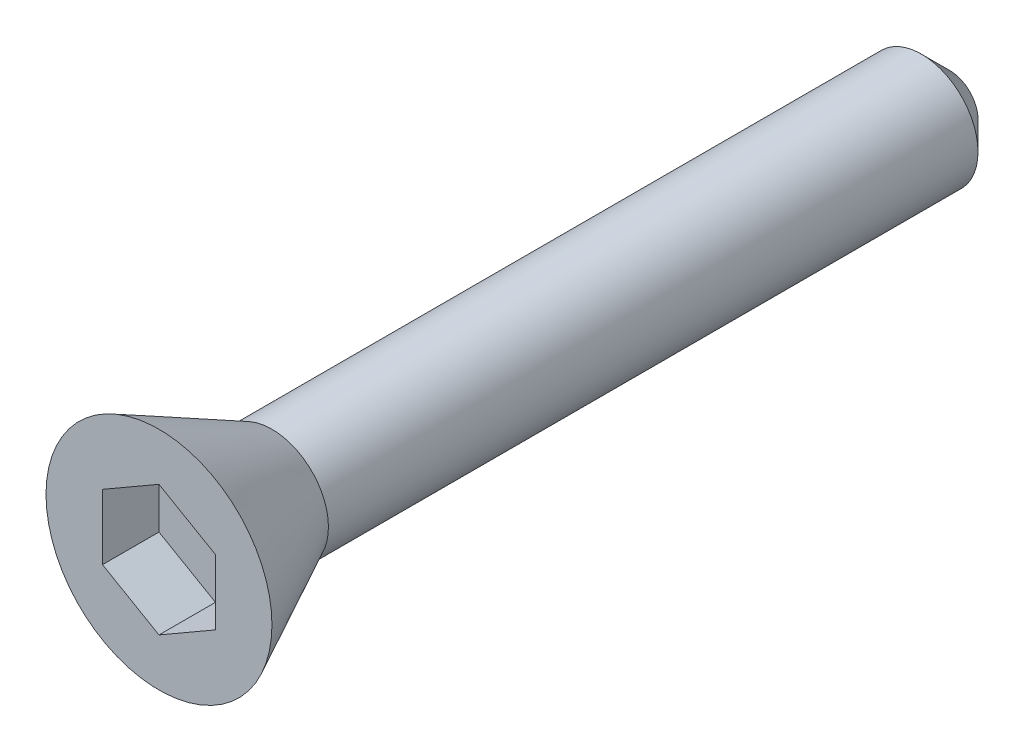
ISO-10303-21;
HEADER;
FILE_DESCRIPTION(('STEP AP214'),'2;1');
FILE_NAME('part.step','',(''),(''),'','','');
FILE_SCHEMA(('AUTOMOTIVE_DESIGN { 1 0 10303 214 1 1 1 1 }'));
ENDSEC;
DATA;
#1=APPLICATION_CONTEXT('core data for automotive mechanical design processes');
#2=APPLICATION_PROTOCOL_DEFINITION('international standard','automotive_design',2000,#1);
#3=PRODUCT_CONTEXT('',#1,'mechanical');
#4=PRODUCT('Part','Part','',(#3));
#5=PRODUCT_RELATED_PRODUCT_CATEGORY('part','',(#4));
#6=PRODUCT_DEFINITION_FORMATION('','',#4);
#7=PRODUCT_DEFINITION_CONTEXT('part definition',#1,'design');
#8=PRODUCT_DEFINITION('design','',#6,#7);
#9=PRODUCT_DEFINITION_SHAPE('','',#8);
#10=(LENGTH_UNIT() NAMED_UNIT(*) SI_UNIT(.MILLI.,.METRE.));
#11=(NAMED_UNIT(*) PLANE_ANGLE_UNIT() SI_UNIT($,.RADIAN.));
#12=(NAMED_UNIT(*) SI_UNIT($,.STERADIAN.) SOLID_ANGLE_UNIT());
#13=UNCERTAINTY_MEASURE_WITH_UNIT(LENGTH_MEASURE(1.E-05),#10,'distance_accuracy_value','');
#14=(GEOMETRIC_REPRESENTATION_CONTEXT(3) GLOBAL_UNCERTAINTY_ASSIGNED_CONTEXT((#13)) GLOBAL_UNIT_ASSIGNED_CONTEXT((#10,
#11,#12)) REPRESENTATION_CONTEXT('',''));
#15=CARTESIAN_POINT('',(0.,0.,0.));
#16=DIRECTION('',(0.,0.,1.));
#17=DIRECTION('',(1.,0.,0.));
#18=AXIS2_PLACEMENT_3D('',#15,#16,#17);
#19=CARTESIAN_POINT('',(0.,0.,0.));
#20=DIRECTION('',(0.,0.,-1.));
#21=DIRECTION('',(-1.,0.,0.));
#22=AXIS2_PLACEMENT_3D('',#19,#20,#21);
#23=PLANE('',#22);
#24=DIRECTION('',(-0.866025403784439,-0.5,0.));
#25=VECTOR('',#24,1.);
#26=CARTESIAN_POINT('',(0.,1.15470053837925,0.));
#27=LINE('',#26,#25);
#28=CARTESIAN_POINT('',(0.,1.15470053837925,0.));
#29=VERTEX_POINT('',#28);
#30=CARTESIAN_POINT('',(-1.,0.577350269189626,0.));
#31=VERTEX_POINT('',#30);
#32=EDGE_CURVE('E121',#29,#31,#27,.T.);
#33=ORIENTED_EDGE('',*,*,#32,.F.);
#34=DIRECTION('',(-0.866025403784439,0.5,0.));
#35=VECTOR('',#34,1.);
#36=CARTESIAN_POINT('',(1.,0.577350269189626,0.));
#37=LINE('',#36,#35);
#38=CARTESIAN_POINT('',(1.,0.577350269189626,0.));
#39=VERTEX_POINT('',#38);
#40=EDGE_CURVE('E47',#39,#29,#37,.T.);
#41=ORIENTED_EDGE('',*,*,#40,.F.);
#42=DIRECTION('',(0.,1.,0.));
#43=VECTOR('',#42,1.);
#44=CARTESIAN_POINT('',(1.,-0.577350269189626,0.));
#45=LINE('',#44,#43);
#46=CARTESIAN_POINT('',(1.,-0.577350269189626,0.));
#47=VERTEX_POINT('',#46);
#48=EDGE_CURVE('E130',#47,#39,#45,.T.);
#49=ORIENTED_EDGE('',*,*,#48,.F.);
#50=DIRECTION('',(0.866025403784439,0.5,0.));
#51=VECTOR('',#50,1.);
#52=CARTESIAN_POINT('',(0.,-1.15470053837925,0.));
#53=LINE('',#52,#51);
#54=CARTESIAN_POINT('',(0.,-1.15470053837925,0.));
#55=VERTEX_POINT('',#54);
#56=EDGE_CURVE('E128',#55,#47,#53,.T.);
#57=ORIENTED_EDGE('',*,*,#56,.F.);
#58=DIRECTION('',(0.866025403784439,-0.5,0.));
#59=VECTOR('',#58,1.);
#60=CARTESIAN_POINT('',(-1.,-0.577350269189626,0.));
#61=LINE('',#60,#59);
#62=CARTESIAN_POINT('',(-1.,-0.577350269189626,0.));
#63=VERTEX_POINT('',#62);
#64=EDGE_CURVE('E95',#63,#55,#61,.T.);
#65=ORIENTED_EDGE('',*,*,#64,.F.);
#66=DIRECTION('',(0.,-1.,0.));
#67=VECTOR('',#66,1.);
#68=CARTESIAN_POINT('',(-1.,0.577350269189626,0.));
#69=LINE('',#68,#67);
#70=EDGE_CURVE('E124',#31,#63,#69,.T.);
#71=ORIENTED_EDGE('',*,*,#70,.F.);
#72=EDGE_LOOP('',(#33,#41,#49,#57,#65,#71));
#73=FACE_BOUND('',#72,.T.);
#74=CARTESIAN_POINT('',(0.,0.,0.));
#75=DIRECTION('',(0.,0.,1.));
#76=DIRECTION('',(1.,0.,0.));
#77=AXIS2_PLACEMENT_3D('',#74,#75,#76);
#78=CIRCLE('',#77,2.);
#79=CARTESIAN_POINT('',(2.,0.,0.));
#80=VERTEX_POINT('',#79);
#81=EDGE_CURVE('E142',#80,#80,#78,.T.);
#82=ORIENTED_EDGE('',*,*,#81,.T.);
#83=EDGE_LOOP('',(#82));
#84=FACE_BOUND('',#83,.T.);
#85=ADVANCED_FACE('F32',(#73,#84),#23,.F.);
#86=CARTESIAN_POINT('',(0.,0.,-2.));
#87=DIRECTION('',(0.,0.,1.));
#88=DIRECTION('',(1.,0.,0.));
#89=AXIS2_PLACEMENT_3D('',#86,#87,#88);
#90=CONICAL_SURFACE('',#89,1.,0.463647609000806);
#91=ORIENTED_EDGE('',*,*,#81,.F.);
#92=EDGE_LOOP('',(#91));
#93=FACE_BOUND('',#92,.T.);
#94=CARTESIAN_POINT('',(0.,0.,-2.));
#95=DIRECTION('',(0.,0.,1.));
#96=DIRECTION('',(1.,0.,0.));
#97=AXIS2_PLACEMENT_3D('',#94,#95,#96);
#98=CIRCLE('',#97,1.);
#99=CARTESIAN_POINT('',(1.,0.,-2.));
#100=VERTEX_POINT('',#99);
#101=EDGE_CURVE('E134',#100,#100,#98,.T.);
#102=ORIENTED_EDGE('',*,*,#101,.T.);
#103=EDGE_LOOP('',(#102));
#104=FACE_BOUND('',#103,.T.);
#105=ADVANCED_FACE('F159',(#93,#104),#90,.T.);
#106=CARTESIAN_POINT('',(0.,0.,58.5147444804715));
#107=DIRECTION('',(0.,0.,1.));
#108=DIRECTION('',(1.,0.,0.));
#109=AXIS2_PLACEMENT_3D('',#106,#107,#108);
#110=CYLINDRICAL_SURFACE('',#109,1.);
#111=CARTESIAN_POINT('',(0.,0.,-13.5));
#112=DIRECTION('',(0.,0.,1.));
#113=DIRECTION('',(1.,0.,0.));
#114=AXIS2_PLACEMENT_3D('',#111,#112,#113);
#115=CIRCLE('',#114,1.);
#116=CARTESIAN_POINT('',(1.,0.,-13.5));
#117=VERTEX_POINT('',#116);
#118=EDGE_CURVE('E40',#117,#117,#115,.T.);
#119=ORIENTED_EDGE('',*,*,#118,.T.);
#120=EDGE_LOOP('',(#119));
#121=FACE_BOUND('',#120,.T.);
#122=ORIENTED_EDGE('',*,*,#101,.F.);
#123=EDGE_LOOP('',(#122));
#124=FACE_BOUND('',#123,.T.);
#125=ADVANCED_FACE('F147',(#121,#124),#110,.T.);
#126=CARTESIAN_POINT('',(0.,1.,-14.));
#127=DIRECTION('',(0.,0.,1.));
#128=DIRECTION('',(1.,0.,0.));
#129=AXIS2_PLACEMENT_3D('',#126,#127,#128);
#130=PLANE('',#129);
#131=CARTESIAN_POINT('',(0.,0.,-14.));
#132=DIRECTION('',(0.,0.,1.));
#133=DIRECTION('',(1.,0.,0.));
#134=AXIS2_PLACEMENT_3D('',#131,#132,#133);
#135=CIRCLE('',#134,0.500000000000009);
#136=CARTESIAN_POINT('',(0.500000000000009,0.,-14.));
#137=VERTEX_POINT('',#136);
#138=EDGE_CURVE('E11',#137,#137,#135,.F.);
#139=ORIENTED_EDGE('',*,*,#138,.T.);
#140=EDGE_LOOP('',(#139));
#141=FACE_BOUND('',#140,.T.);
#142=ADVANCED_FACE('F171',(#141),#130,.F.);
#143=CARTESIAN_POINT('',(1.,0.577350269189626,-1.));
#144=DIRECTION('',(0.5,0.866025403784439,0.));
#145=DIRECTION('',(-0.866025403784439,0.5,0.));
#146=AXIS2_PLACEMENT_3D('',#143,#144,#145);
#147=PLANE('',#146);
#148=ORIENTED_EDGE('',*,*,#40,.T.);
#149=DIRECTION('',(0.,0.,1.));
#150=VECTOR('',#149,1.);
#151=CARTESIAN_POINT('',(0.,1.15470053837925,-1.));
#152=LINE('',#151,#150);
#153=CARTESIAN_POINT('',(0.,1.15470053837925,-1.));
#154=VERTEX_POINT('',#153);
#155=EDGE_CURVE('E77',#154,#29,#152,.T.);
#156=ORIENTED_EDGE('',*,*,#155,.F.);
#157=DIRECTION('',(-0.866025403784439,0.5,0.));
#158=VECTOR('',#157,1.);
#159=CARTESIAN_POINT('',(1.,0.577350269189626,-1.));
#160=LINE('',#159,#158);
#161=CARTESIAN_POINT('',(1.,0.577350269189626,-1.));
#162=VERTEX_POINT('',#161);
#163=EDGE_CURVE('E132',#162,#154,#160,.T.);
#164=ORIENTED_EDGE('',*,*,#163,.F.);
#165=DIRECTION('',(0.,0.,1.));
#166=VECTOR('',#165,1.);
#167=CARTESIAN_POINT('',(1.,0.577350269189626,-1.));
#168=LINE('',#167,#166);
#169=EDGE_CURVE('E55',#162,#39,#168,.T.);
#170=ORIENTED_EDGE('',*,*,#169,.T.);
#171=EDGE_LOOP('',(#148,#156,#164,#170));
#172=FACE_BOUND('',#171,.T.);
#173=ADVANCED_FACE('F174',(#172),#147,.F.);
#174=CARTESIAN_POINT('',(1.,-0.577350269189626,-1.));
#175=DIRECTION('',(1.,0.,0.));
#176=DIRECTION('',(0.,0.,-1.));
#177=AXIS2_PLACEMENT_3D('',#174,#175,#176);
#178=PLANE('',#177);
#179=ORIENTED_EDGE('',*,*,#48,.T.);
#180=ORIENTED_EDGE('',*,*,#169,.F.);
#181=DIRECTION('',(0.,1.,0.));
#182=VECTOR('',#181,1.);
#183=CARTESIAN_POINT('',(1.,-0.577350269189626,-1.));
#184=LINE('',#183,#182);
#185=CARTESIAN_POINT('',(1.,-0.577350269189626,-1.));
#186=VERTEX_POINT('',#185);
#187=EDGE_CURVE('E107',#186,#162,#184,.T.);
#188=ORIENTED_EDGE('',*,*,#187,.F.);
#189=DIRECTION('',(0.,0.,1.));
#190=VECTOR('',#189,1.);
#191=CARTESIAN_POINT('',(1.,-0.577350269189626,-1.));
#192=LINE('',#191,#190);
#193=EDGE_CURVE('E99',#186,#47,#192,.T.);
#194=ORIENTED_EDGE('',*,*,#193,.T.);
#195=EDGE_LOOP('',(#179,#180,#188,#194));
#196=FACE_BOUND('',#195,.T.);
#197=ADVANCED_FACE('F178',(#196),#178,.F.);
#198=CARTESIAN_POINT('',(0.,-1.15470053837925,-1.));
#199=DIRECTION('',(0.5,-0.866025403784439,0.));
#200=DIRECTION('',(0.866025403784439,0.5,0.));
#201=AXIS2_PLACEMENT_3D('',#198,#199,#200);
#202=PLANE('',#201);
#203=ORIENTED_EDGE('',*,*,#56,.T.);
#204=ORIENTED_EDGE('',*,*,#193,.F.);
#205=DIRECTION('',(0.866025403784439,0.5,0.));
#206=VECTOR('',#205,1.);
#207=CARTESIAN_POINT('',(0.,-1.15470053837925,-1.));
#208=LINE('',#207,#206);
#209=CARTESIAN_POINT('',(0.,-1.15470053837925,-1.));
#210=VERTEX_POINT('',#209);
#211=EDGE_CURVE('E103',#210,#186,#208,.T.);
#212=ORIENTED_EDGE('',*,*,#211,.F.);
#213=DIRECTION('',(0.,0.,1.));
#214=VECTOR('',#213,1.);
#215=CARTESIAN_POINT('',(0.,-1.15470053837925,-1.));
#216=LINE('',#215,#214);
#217=EDGE_CURVE('E88',#210,#55,#216,.T.);
#218=ORIENTED_EDGE('',*,*,#217,.T.);
#219=EDGE_LOOP('',(#203,#204,#212,#218));
#220=FACE_BOUND('',#219,.T.);
#221=ADVANCED_FACE('F104',(#220),#202,.F.);
#222=CARTESIAN_POINT('',(-1.,-0.577350269189626,-1.));
#223=DIRECTION('',(-0.5,-0.866025403784439,0.));
#224=DIRECTION('',(0.866025403784439,-0.5,0.));
#225=AXIS2_PLACEMENT_3D('',#222,#223,#224);
#226=PLANE('',#225);
#227=ORIENTED_EDGE('',*,*,#64,.T.);
#228=ORIENTED_EDGE('',*,*,#217,.F.);
#229=DIRECTION('',(0.866025403784439,-0.5,0.));
#230=VECTOR('',#229,1.);
#231=CARTESIAN_POINT('',(-1.,-0.577350269189626,-1.));
#232=LINE('',#231,#230);
#233=CARTESIAN_POINT('',(-1.,-0.577350269189626,-1.));
#234=VERTEX_POINT('',#233);
#235=EDGE_CURVE('E92',#234,#210,#232,.T.);
#236=ORIENTED_EDGE('',*,*,#235,.F.);
#237=DIRECTION('',(0.,0.,1.));
#238=VECTOR('',#237,1.);
#239=CARTESIAN_POINT('',(-1.,-0.577350269189626,-1.));
#240=LINE('',#239,#238);
#241=EDGE_CURVE('E100',#234,#63,#240,.T.);
#242=ORIENTED_EDGE('',*,*,#241,.T.);
#243=EDGE_LOOP('',(#227,#228,#236,#242));
#244=FACE_BOUND('',#243,.T.);
#245=ADVANCED_FACE('F90',(#244),#226,.F.);
#246=CARTESIAN_POINT('',(-1.,0.577350269189626,-1.));
#247=DIRECTION('',(-1.,0.,0.));
#248=DIRECTION('',(0.,0.,1.));
#249=AXIS2_PLACEMENT_3D('',#246,#247,#248);
#250=PLANE('',#249);
#251=ORIENTED_EDGE('',*,*,#70,.T.);
#252=ORIENTED_EDGE('',*,*,#241,.F.);
#253=DIRECTION('',(0.,-1.,0.));
#254=VECTOR('',#253,1.);
#255=CARTESIAN_POINT('',(-1.,0.577350269189626,-1.));
#256=LINE('',#255,#254);
#257=CARTESIAN_POINT('',(-1.,0.577350269189626,-1.));
#258=VERTEX_POINT('',#257);
#259=EDGE_CURVE('E113',#258,#234,#256,.T.);
#260=ORIENTED_EDGE('',*,*,#259,.F.);
#261=DIRECTION('',(0.,0.,1.));
#262=VECTOR('',#261,1.);
#263=CARTESIAN_POINT('',(-1.,0.577350269189626,-1.));
#264=LINE('',#263,#262);
#265=EDGE_CURVE('E137',#258,#31,#264,.T.);
#266=ORIENTED_EDGE('',*,*,#265,.T.);
#267=EDGE_LOOP('',(#251,#252,#260,#266));
#268=FACE_BOUND('',#267,.T.);
#269=ADVANCED_FACE('F181',(#268),#250,.F.);
#270=CARTESIAN_POINT('',(0.,1.15470053837925,-1.));
#271=DIRECTION('',(-0.5,0.866025403784439,0.));
#272=DIRECTION('',(-0.866025403784439,-0.5,0.));
#273=AXIS2_PLACEMENT_3D('',#270,#271,#272);
#274=PLANE('',#273);
#275=ORIENTED_EDGE('',*,*,#32,.T.);
#276=ORIENTED_EDGE('',*,*,#265,.F.);
#277=DIRECTION('',(-0.866025403784439,-0.5,0.));
#278=VECTOR('',#277,1.);
#279=CARTESIAN_POINT('',(0.,1.15470053837925,-1.));
#280=LINE('',#279,#278);
#281=EDGE_CURVE('E115',#154,#258,#280,.T.);
#282=ORIENTED_EDGE('',*,*,#281,.F.);
#283=ORIENTED_EDGE('',*,*,#155,.T.);
#284=EDGE_LOOP('',(#275,#276,#282,#283));
#285=FACE_BOUND('',#284,.T.);
#286=ADVANCED_FACE('F155',(#285),#274,.F.);
#287=CARTESIAN_POINT('',(0.,0.,-1.));
#288=DIRECTION('',(0.,0.,1.));
#289=DIRECTION('',(1.,0.,0.));
#290=AXIS2_PLACEMENT_3D('',#287,#288,#289);
#291=PLANE('',#290);
#292=ORIENTED_EDGE('',*,*,#163,.T.);
#293=ORIENTED_EDGE('',*,*,#281,.T.);
#294=ORIENTED_EDGE('',*,*,#259,.T.);
#295=ORIENTED_EDGE('',*,*,#235,.T.);
#296=ORIENTED_EDGE('',*,*,#211,.T.);
#297=ORIENTED_EDGE('',*,*,#187,.T.);
#298=EDGE_LOOP('',(#292,#293,#294,#295,#296,#297));
#299=FACE_BOUND('',#298,.T.);
#300=ADVANCED_FACE('F110',(#299),#291,.T.);
#301=CARTESIAN_POINT('',(0.,0.,-13.5));
#302=DIRECTION('',(0.,0.,1.));
#303=DIRECTION('',(1.,0.,0.));
#304=AXIS2_PLACEMENT_3D('',#301,#302,#303);
#305=CONICAL_SURFACE('',#304,1.,0.785398163397444);
#306=ORIENTED_EDGE('',*,*,#138,.F.);
#307=EDGE_LOOP('',(#306));
#308=FACE_BOUND('',#307,.T.);
#309=ORIENTED_EDGE('',*,*,#118,.F.);
#310=EDGE_LOOP('',(#309));
#311=FACE_BOUND('',#310,.T.);
#312=ADVANCED_FACE('F34',(#308,#311),#305,.T.);
#313=CLOSED_SHELL('',(#85,#105,#125,#142,#173,#197,#221,#245,#269,#286,#300,#312));
#314=MANIFOLD_SOLID_BREP('B2',#313);
#315=ADVANCED_BREP_SHAPE_REPRESENTATION('',(#18,#314),#14);
#316=SHAPE_DEFINITION_REPRESENTATION(#9,#315);
ENDSEC;
END-ISO-10303-21;
